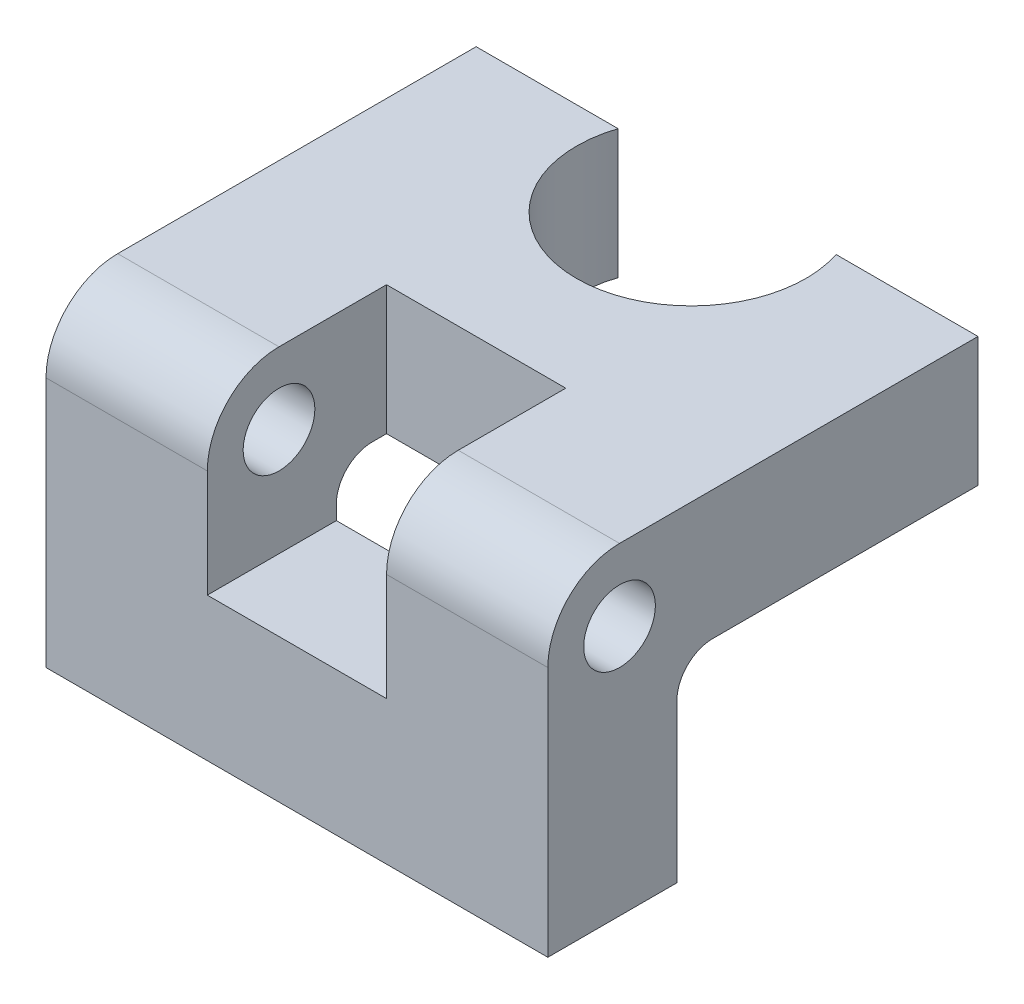
ISO-10303-21;
HEADER;
FILE_DESCRIPTION(('STEP AP214'),'2;1');
FILE_NAME('part.step','',(''),(''),'','','');
FILE_SCHEMA(('AUTOMOTIVE_DESIGN { 1 0 10303 214 1 1 1 1 }'));
ENDSEC;
DATA;
#1=APPLICATION_CONTEXT('core data for automotive mechanical design processes');
#2=APPLICATION_PROTOCOL_DEFINITION('international standard','automotive_design',2000,#1);
#3=PRODUCT_CONTEXT('',#1,'mechanical');
#4=PRODUCT('Part','Part','',(#3));
#5=PRODUCT_RELATED_PRODUCT_CATEGORY('part','',(#4));
#6=PRODUCT_DEFINITION_FORMATION('','',#4);
#7=PRODUCT_DEFINITION_CONTEXT('part definition',#1,'design');
#8=PRODUCT_DEFINITION('design','',#6,#7);
#9=PRODUCT_DEFINITION_SHAPE('','',#8);
#10=(LENGTH_UNIT() NAMED_UNIT(*) SI_UNIT(.MILLI.,.METRE.));
#11=(NAMED_UNIT(*) PLANE_ANGLE_UNIT() SI_UNIT($,.RADIAN.));
#12=(NAMED_UNIT(*) SI_UNIT($,.STERADIAN.) SOLID_ANGLE_UNIT());
#13=UNCERTAINTY_MEASURE_WITH_UNIT(LENGTH_MEASURE(1.E-05),#10,'distance_accuracy_value','');
#14=(GEOMETRIC_REPRESENTATION_CONTEXT(3) GLOBAL_UNCERTAINTY_ASSIGNED_CONTEXT((#13)) GLOBAL_UNIT_ASSIGNED_CONTEXT((#10,
#11,#12)) REPRESENTATION_CONTEXT('',''));
#15=CARTESIAN_POINT('',(0.,0.,0.));
#16=DIRECTION('',(0.,0.,1.));
#17=DIRECTION('',(1.,0.,0.));
#18=AXIS2_PLACEMENT_3D('',#15,#16,#17);
#19=CARTESIAN_POINT('',(0.,45.,-60.));
#20=DIRECTION('',(0.,0.,1.));
#21=DIRECTION('',(1.,0.,0.));
#22=AXIS2_PLACEMENT_3D('',#19,#20,#21);
#23=PLANE('',#22);
#24=DIRECTION('',(1.,0.,0.));
#25=VECTOR('',#24,1.);
#26=CARTESIAN_POINT('',(0.,27.,-60.));
#27=LINE('',#26,#25);
#28=CARTESIAN_POINT('',(50.1986841535707,27.,-60.));
#29=VERTEX_POINT('',#28);
#30=CARTESIAN_POINT('',(70.,27.,-60.));
#31=VERTEX_POINT('',#30);
#32=EDGE_CURVE('E235',#29,#31,#27,.T.);
#33=ORIENTED_EDGE('',*,*,#32,.F.);
#34=DIRECTION('',(0.,1.,0.));
#35=VECTOR('',#34,1.);
#36=CARTESIAN_POINT('',(50.1986841535707,0.,-60.));
#37=LINE('',#36,#35);
#38=CARTESIAN_POINT('',(50.1986841535707,45.,-60.));
#39=VERTEX_POINT('',#38);
#40=EDGE_CURVE('E222',#29,#39,#37,.T.);
#41=ORIENTED_EDGE('',*,*,#40,.T.);
#42=DIRECTION('',(-1.,0.,0.));
#43=VECTOR('',#42,1.);
#44=CARTESIAN_POINT('',(0.,45.,-60.));
#45=LINE('',#44,#43);
#46=CARTESIAN_POINT('',(70.,45.,-60.));
#47=VERTEX_POINT('',#46);
#48=EDGE_CURVE('E257',#47,#39,#45,.T.);
#49=ORIENTED_EDGE('',*,*,#48,.F.);
#50=DIRECTION('',(0.,-1.,0.));
#51=VECTOR('',#50,1.);
#52=CARTESIAN_POINT('',(70.,45.,-60.));
#53=LINE('',#52,#51);
#54=EDGE_CURVE('E275',#47,#31,#53,.T.);
#55=ORIENTED_EDGE('',*,*,#54,.T.);
#56=EDGE_LOOP('',(#33,#41,#49,#55));
#57=FACE_BOUND('',#56,.T.);
#58=ADVANCED_FACE('F39',(#57),#23,.F.);
#59=CARTESIAN_POINT('',(0.,45.,0.));
#60=DIRECTION('',(1.,0.,0.));
#61=DIRECTION('',(0.,0.,-1.));
#62=AXIS2_PLACEMENT_3D('',#59,#60,#61);
#63=PLANE('',#62);
#64=CARTESIAN_POINT('',(0.,35.,-10.));
#65=DIRECTION('',(1.,0.,0.));
#66=DIRECTION('',(0.,0.,-1.));
#67=AXIS2_PLACEMENT_3D('',#64,#65,#66);
#68=CIRCLE('',#67,5.);
#69=CARTESIAN_POINT('',(0.,35.,-15.));
#70=VERTEX_POINT('',#69);
#71=EDGE_CURVE('E391',#70,#70,#68,.T.);
#72=ORIENTED_EDGE('',*,*,#71,.T.);
#73=EDGE_LOOP('',(#72));
#74=FACE_BOUND('',#73,.T.);
#75=DIRECTION('',(0.,-1.,0.));
#76=VECTOR('',#75,1.);
#77=CARTESIAN_POINT('',(0.,45.,0.));
#78=LINE('',#77,#76);
#79=CARTESIAN_POINT('',(0.,35.,0.));
#80=VERTEX_POINT('',#79);
#81=CARTESIAN_POINT('',(0.,0.,0.));
#82=VERTEX_POINT('',#81);
#83=EDGE_CURVE('E282',#80,#82,#78,.T.);
#84=ORIENTED_EDGE('',*,*,#83,.F.);
#85=CARTESIAN_POINT('',(0.,35.,-10.));
#86=DIRECTION('',(1.,0.,0.));
#87=DIRECTION('',(0.,0.,-1.));
#88=AXIS2_PLACEMENT_3D('',#85,#86,#87);
#89=CIRCLE('',#88,10.);
#90=CARTESIAN_POINT('',(0.,45.,-10.));
#91=VERTEX_POINT('',#90);
#92=EDGE_CURVE('E322',#80,#91,#89,.F.);
#93=ORIENTED_EDGE('',*,*,#92,.T.);
#94=DIRECTION('',(0.,0.,1.));
#95=VECTOR('',#94,1.);
#96=CARTESIAN_POINT('',(0.,45.,0.));
#97=LINE('',#96,#95);
#98=CARTESIAN_POINT('',(0.,45.,-60.));
#99=VERTEX_POINT('',#98);
#100=EDGE_CURVE('E249',#99,#91,#97,.T.);
#101=ORIENTED_EDGE('',*,*,#100,.F.);
#102=DIRECTION('',(0.,-1.,0.));
#103=VECTOR('',#102,1.);
#104=CARTESIAN_POINT('',(0.,45.,-60.));
#105=LINE('',#104,#103);
#106=CARTESIAN_POINT('',(0.,27.,-60.));
#107=VERTEX_POINT('',#106);
#108=EDGE_CURVE('E261',#99,#107,#105,.T.);
#109=ORIENTED_EDGE('',*,*,#108,.T.);
#110=DIRECTION('',(0.,0.,1.));
#111=VECTOR('',#110,1.);
#112=CARTESIAN_POINT('',(0.,27.,-18.));
#113=LINE('',#112,#111);
#114=CARTESIAN_POINT('',(0.,27.,-23.));
#115=VERTEX_POINT('',#114);
#116=EDGE_CURVE('E227',#107,#115,#113,.T.);
#117=ORIENTED_EDGE('',*,*,#116,.T.);
#118=CARTESIAN_POINT('',(0.,22.,-23.));
#119=DIRECTION('',(1.,0.,0.));
#120=DIRECTION('',(0.,0.,-1.));
#121=AXIS2_PLACEMENT_3D('',#118,#119,#120);
#122=CIRCLE('',#121,5.);
#123=CARTESIAN_POINT('',(0.,22.,-18.));
#124=VERTEX_POINT('',#123);
#125=EDGE_CURVE('E341',#115,#124,#122,.T.);
#126=ORIENTED_EDGE('',*,*,#125,.T.);
#127=DIRECTION('',(0.,-1.,0.));
#128=VECTOR('',#127,1.);
#129=CARTESIAN_POINT('',(0.,0.,-18.));
#130=LINE('',#129,#128);
#131=CARTESIAN_POINT('',(0.,0.,-18.));
#132=VERTEX_POINT('',#131);
#133=EDGE_CURVE('E231',#124,#132,#130,.T.);
#134=ORIENTED_EDGE('',*,*,#133,.T.);
#135=DIRECTION('',(0.,0.,1.));
#136=VECTOR('',#135,1.);
#137=CARTESIAN_POINT('',(0.,0.,0.));
#138=LINE('',#137,#136);
#139=EDGE_CURVE('E244',#132,#82,#138,.T.);
#140=ORIENTED_EDGE('',*,*,#139,.T.);
#141=EDGE_LOOP('',(#84,#93,#101,#109,#117,#126,#134,#140));
#142=FACE_BOUND('',#141,.T.);
#143=ADVANCED_FACE('F415',(#74,#142),#63,.F.);
#144=CARTESIAN_POINT('',(0.,45.,0.));
#145=DIRECTION('',(0.,0.,-1.));
#146=DIRECTION('',(-1.,0.,0.));
#147=AXIS2_PLACEMENT_3D('',#144,#145,#146);
#148=PLANE('',#147);
#149=DIRECTION('',(0.,-1.,0.));
#150=VECTOR('',#149,1.);
#151=CARTESIAN_POINT('',(70.,45.,0.));
#152=LINE('',#151,#150);
#153=CARTESIAN_POINT('',(70.,35.,0.));
#154=VERTEX_POINT('',#153);
#155=CARTESIAN_POINT('',(70.,0.,0.));
#156=VERTEX_POINT('',#155);
#157=EDGE_CURVE('E279',#154,#156,#152,.T.);
#158=ORIENTED_EDGE('',*,*,#157,.F.);
#159=DIRECTION('',(1.,0.,0.));
#160=VECTOR('',#159,1.);
#161=CARTESIAN_POINT('',(0.,35.,0.));
#162=LINE('',#161,#160);
#163=CARTESIAN_POINT('',(47.5,35.,0.));
#164=VERTEX_POINT('',#163);
#165=EDGE_CURVE('E313',#154,#164,#162,.F.);
#166=ORIENTED_EDGE('',*,*,#165,.T.);
#167=DIRECTION('',(0.,1.,0.));
#168=VECTOR('',#167,1.);
#169=CARTESIAN_POINT('',(47.5,45.,0.));
#170=LINE('',#169,#168);
#171=CARTESIAN_POINT('',(47.5,20.,0.));
#172=VERTEX_POINT('',#171);
#173=EDGE_CURVE('E177',#172,#164,#170,.T.);
#174=ORIENTED_EDGE('',*,*,#173,.F.);
#175=DIRECTION('',(1.,0.,0.));
#176=VECTOR('',#175,1.);
#177=CARTESIAN_POINT('',(22.5,20.,0.));
#178=LINE('',#177,#176);
#179=CARTESIAN_POINT('',(22.5,20.,0.));
#180=VERTEX_POINT('',#179);
#181=EDGE_CURVE('E374',#180,#172,#178,.T.);
#182=ORIENTED_EDGE('',*,*,#181,.F.);
#183=DIRECTION('',(0.,-1.,0.));
#184=VECTOR('',#183,1.);
#185=CARTESIAN_POINT('',(22.5,45.,0.));
#186=LINE('',#185,#184);
#187=CARTESIAN_POINT('',(22.5,35.,0.));
#188=VERTEX_POINT('',#187);
#189=EDGE_CURVE('E376',#188,#180,#186,.T.);
#190=ORIENTED_EDGE('',*,*,#189,.F.);
#191=DIRECTION('',(1.,0.,0.));
#192=VECTOR('',#191,1.);
#193=CARTESIAN_POINT('',(0.,35.,0.));
#194=LINE('',#193,#192);
#195=EDGE_CURVE('E310',#188,#80,#194,.F.);
#196=ORIENTED_EDGE('',*,*,#195,.T.);
#197=ORIENTED_EDGE('',*,*,#83,.T.);
#198=DIRECTION('',(1.,0.,0.));
#199=VECTOR('',#198,1.);
#200=CARTESIAN_POINT('',(0.,0.,0.));
#201=LINE('',#200,#199);
#202=EDGE_CURVE('E265',#82,#156,#201,.T.);
#203=ORIENTED_EDGE('',*,*,#202,.T.);
#204=EDGE_LOOP('',(#158,#166,#174,#182,#190,#196,#197,#203));
#205=FACE_BOUND('',#204,.T.);
#206=ADVANCED_FACE('F361',(#205),#148,.F.);
#207=CARTESIAN_POINT('',(70.,45.,0.));
#208=DIRECTION('',(-1.,0.,0.));
#209=DIRECTION('',(0.,0.,1.));
#210=AXIS2_PLACEMENT_3D('',#207,#208,#209);
#211=PLANE('',#210);
#212=CARTESIAN_POINT('',(70.,35.,-10.));
#213=DIRECTION('',(1.,0.,0.));
#214=DIRECTION('',(0.,0.,-1.));
#215=AXIS2_PLACEMENT_3D('',#212,#213,#214);
#216=CIRCLE('',#215,5.);
#217=CARTESIAN_POINT('',(70.,35.,-15.));
#218=VERTEX_POINT('',#217);
#219=EDGE_CURVE('E387',#218,#218,#216,.T.);
#220=ORIENTED_EDGE('',*,*,#219,.F.);
#221=EDGE_LOOP('',(#220));
#222=FACE_BOUND('',#221,.T.);
#223=DIRECTION('',(0.,0.,-1.));
#224=VECTOR('',#223,1.);
#225=CARTESIAN_POINT('',(70.,45.,0.));
#226=LINE('',#225,#224);
#227=CARTESIAN_POINT('',(70.,45.,-10.));
#228=VERTEX_POINT('',#227);
#229=EDGE_CURVE('E252',#228,#47,#226,.T.);
#230=ORIENTED_EDGE('',*,*,#229,.F.);
#231=CARTESIAN_POINT('',(70.,35.,-10.));
#232=DIRECTION('',(-1.,0.,0.));
#233=DIRECTION('',(0.,0.,1.));
#234=AXIS2_PLACEMENT_3D('',#231,#232,#233);
#235=CIRCLE('',#234,10.);
#236=EDGE_CURVE('E307',#228,#154,#235,.F.);
#237=ORIENTED_EDGE('',*,*,#236,.T.);
#238=ORIENTED_EDGE('',*,*,#157,.T.);
#239=DIRECTION('',(0.,0.,-1.));
#240=VECTOR('',#239,1.);
#241=CARTESIAN_POINT('',(70.,0.,0.));
#242=LINE('',#241,#240);
#243=CARTESIAN_POINT('',(70.,0.,-18.));
#244=VERTEX_POINT('',#243);
#245=EDGE_CURVE('E253',#156,#244,#242,.T.);
#246=ORIENTED_EDGE('',*,*,#245,.T.);
#247=DIRECTION('',(0.,-1.,0.));
#248=VECTOR('',#247,1.);
#249=CARTESIAN_POINT('',(70.,0.,-18.));
#250=LINE('',#249,#248);
#251=CARTESIAN_POINT('',(70.,22.,-18.));
#252=VERTEX_POINT('',#251);
#253=EDGE_CURVE('E232',#252,#244,#250,.T.);
#254=ORIENTED_EDGE('',*,*,#253,.F.);
#255=CARTESIAN_POINT('',(70.,22.,-23.));
#256=DIRECTION('',(-1.,0.,0.));
#257=DIRECTION('',(0.,0.,1.));
#258=AXIS2_PLACEMENT_3D('',#255,#256,#257);
#259=CIRCLE('',#258,5.);
#260=CARTESIAN_POINT('',(70.,27.,-23.));
#261=VERTEX_POINT('',#260);
#262=EDGE_CURVE('E49',#252,#261,#259,.T.);
#263=ORIENTED_EDGE('',*,*,#262,.T.);
#264=DIRECTION('',(0.,0.,1.));
#265=VECTOR('',#264,1.);
#266=CARTESIAN_POINT('',(70.,27.,-18.));
#267=LINE('',#266,#265);
#268=EDGE_CURVE('E226',#31,#261,#267,.T.);
#269=ORIENTED_EDGE('',*,*,#268,.F.);
#270=ORIENTED_EDGE('',*,*,#54,.F.);
#271=EDGE_LOOP('',(#230,#237,#238,#246,#254,#263,#269,#270));
#272=FACE_BOUND('',#271,.T.);
#273=ADVANCED_FACE('F352',(#222,#272),#211,.F.);
#274=CARTESIAN_POINT('',(19.8013158464293,45.,-60.));
#275=VERTEX_POINT('',#274);
#276=EDGE_CURVE('E256',#275,#99,#45,.T.);
#277=ORIENTED_EDGE('',*,*,#276,.F.);
#278=DIRECTION('',(0.,1.,0.));
#279=VECTOR('',#278,1.);
#280=CARTESIAN_POINT('',(19.8013158464293,0.,-60.));
#281=LINE('',#280,#279);
#282=CARTESIAN_POINT('',(19.8013158464293,27.,-60.));
#283=VERTEX_POINT('',#282);
#284=EDGE_CURVE('E218',#275,#283,#281,.F.);
#285=ORIENTED_EDGE('',*,*,#284,.T.);
#286=EDGE_CURVE('E245',#107,#283,#27,.T.);
#287=ORIENTED_EDGE('',*,*,#286,.F.);
#288=ORIENTED_EDGE('',*,*,#108,.F.);
#289=EDGE_LOOP('',(#277,#285,#287,#288));
#290=FACE_BOUND('',#289,.T.);
#291=ADVANCED_FACE('F417',(#290),#23,.F.);
#292=CARTESIAN_POINT('',(0.,45.,0.));
#293=DIRECTION('',(0.,-1.,0.));
#294=DIRECTION('',(0.,0.,-1.));
#295=AXIS2_PLACEMENT_3D('',#292,#293,#294);
#296=PLANE('',#295);
#297=DIRECTION('',(0.,0.,1.));
#298=VECTOR('',#297,1.);
#299=CARTESIAN_POINT('',(47.5,45.,-25.));
#300=LINE('',#299,#298);
#301=CARTESIAN_POINT('',(47.5,45.,-25.));
#302=VERTEX_POINT('',#301);
#303=CARTESIAN_POINT('',(47.5,45.,-10.));
#304=VERTEX_POINT('',#303);
#305=EDGE_CURVE('E196',#302,#304,#300,.T.);
#306=ORIENTED_EDGE('',*,*,#305,.T.);
#307=DIRECTION('',(1.,0.,0.));
#308=VECTOR('',#307,1.);
#309=CARTESIAN_POINT('',(0.,45.,-10.));
#310=LINE('',#309,#308);
#311=EDGE_CURVE('E303',#304,#228,#310,.T.);
#312=ORIENTED_EDGE('',*,*,#311,.T.);
#313=ORIENTED_EDGE('',*,*,#229,.T.);
#314=ORIENTED_EDGE('',*,*,#48,.T.);
#315=CARTESIAN_POINT('',(35.,45.,-55.));
#316=DIRECTION('',(0.,1.,0.));
#317=DIRECTION('',(0.,0.,1.));
#318=AXIS2_PLACEMENT_3D('',#315,#316,#317);
#319=CIRCLE('',#318,16.);
#320=EDGE_CURVE('E215',#275,#39,#319,.T.);
#321=ORIENTED_EDGE('',*,*,#320,.F.);
#322=ORIENTED_EDGE('',*,*,#276,.T.);
#323=ORIENTED_EDGE('',*,*,#100,.T.);
#324=DIRECTION('',(1.,0.,0.));
#325=VECTOR('',#324,1.);
#326=CARTESIAN_POINT('',(0.,45.,-10.));
#327=LINE('',#326,#325);
#328=CARTESIAN_POINT('',(22.5,45.,-10.));
#329=VERTEX_POINT('',#328);
#330=EDGE_CURVE('E193',#91,#329,#327,.T.);
#331=ORIENTED_EDGE('',*,*,#330,.T.);
#332=DIRECTION('',(0.,0.,1.));
#333=VECTOR('',#332,1.);
#334=CARTESIAN_POINT('',(22.5,45.,-25.));
#335=LINE('',#334,#333);
#336=CARTESIAN_POINT('',(22.5,45.,-25.));
#337=VERTEX_POINT('',#336);
#338=EDGE_CURVE('E169',#337,#329,#335,.T.);
#339=ORIENTED_EDGE('',*,*,#338,.F.);
#340=DIRECTION('',(-1.,0.,0.));
#341=VECTOR('',#340,1.);
#342=CARTESIAN_POINT('',(22.5,45.,-25.));
#343=LINE('',#342,#341);
#344=EDGE_CURVE('E181',#302,#337,#343,.T.);
#345=ORIENTED_EDGE('',*,*,#344,.F.);
#346=EDGE_LOOP('',(#306,#312,#313,#314,#321,#322,#323,#331,#339,#345));
#347=FACE_BOUND('',#346,.T.);
#348=ADVANCED_FACE('F190',(#347),#296,.F.);
#349=CARTESIAN_POINT('',(0.,0.,0.));
#350=DIRECTION('',(0.,-1.,0.));
#351=DIRECTION('',(0.,0.,-1.));
#352=AXIS2_PLACEMENT_3D('',#349,#350,#351);
#353=PLANE('',#352);
#354=DIRECTION('',(1.,0.,0.));
#355=VECTOR('',#354,1.);
#356=CARTESIAN_POINT('',(0.,0.,-18.));
#357=LINE('',#356,#355);
#358=EDGE_CURVE('E240',#132,#244,#357,.T.);
#359=ORIENTED_EDGE('',*,*,#358,.T.);
#360=ORIENTED_EDGE('',*,*,#245,.F.);
#361=ORIENTED_EDGE('',*,*,#202,.F.);
#362=ORIENTED_EDGE('',*,*,#139,.F.);
#363=EDGE_LOOP('',(#359,#360,#361,#362));
#364=FACE_BOUND('',#363,.T.);
#365=ADVANCED_FACE('F430',(#364),#353,.T.);
#366=CARTESIAN_POINT('',(0.,0.,-18.));
#367=DIRECTION('',(0.,0.,1.));
#368=DIRECTION('',(1.,0.,0.));
#369=AXIS2_PLACEMENT_3D('',#366,#367,#368);
#370=PLANE('',#369);
#371=ORIENTED_EDGE('',*,*,#133,.F.);
#372=DIRECTION('',(1.,0.,0.));
#373=VECTOR('',#372,1.);
#374=CARTESIAN_POINT('',(22.5,22.,-18.));
#375=LINE('',#374,#373);
#376=CARTESIAN_POINT('',(22.5,22.,-18.));
#377=VERTEX_POINT('',#376);
#378=EDGE_CURVE('E329',#124,#377,#375,.T.);
#379=ORIENTED_EDGE('',*,*,#378,.T.);
#380=DIRECTION('',(0.,-1.,0.));
#381=VECTOR('',#380,1.);
#382=CARTESIAN_POINT('',(22.5,0.,-18.));
#383=LINE('',#382,#381);
#384=CARTESIAN_POINT('',(22.5,20.,-18.));
#385=VERTEX_POINT('',#384);
#386=EDGE_CURVE('E201',#377,#385,#383,.T.);
#387=ORIENTED_EDGE('',*,*,#386,.T.);
#388=DIRECTION('',(1.,0.,0.));
#389=VECTOR('',#388,1.);
#390=CARTESIAN_POINT('',(0.,20.,-18.));
#391=LINE('',#390,#389);
#392=CARTESIAN_POINT('',(47.5,20.,-18.));
#393=VERTEX_POINT('',#392);
#394=EDGE_CURVE('E297',#385,#393,#391,.T.);
#395=ORIENTED_EDGE('',*,*,#394,.T.);
#396=DIRECTION('',(0.,1.,0.));
#397=VECTOR('',#396,1.);
#398=CARTESIAN_POINT('',(47.5,0.,-18.));
#399=LINE('',#398,#397);
#400=CARTESIAN_POINT('',(47.5,22.,-18.));
#401=VERTEX_POINT('',#400);
#402=EDGE_CURVE('E195',#393,#401,#399,.T.);
#403=ORIENTED_EDGE('',*,*,#402,.T.);
#404=DIRECTION('',(1.,0.,0.));
#405=VECTOR('',#404,1.);
#406=CARTESIAN_POINT('',(70.,22.,-18.));
#407=LINE('',#406,#405);
#408=EDGE_CURVE('E325',#401,#252,#407,.T.);
#409=ORIENTED_EDGE('',*,*,#408,.T.);
#410=ORIENTED_EDGE('',*,*,#253,.T.);
#411=ORIENTED_EDGE('',*,*,#358,.F.);
#412=EDGE_LOOP('',(#371,#379,#387,#395,#403,#409,#410,#411));
#413=FACE_BOUND('',#412,.T.);
#414=ADVANCED_FACE('F449',(#413),#370,.F.);
#415=CARTESIAN_POINT('',(0.,27.,-18.));
#416=DIRECTION('',(0.,1.,0.));
#417=DIRECTION('',(0.,0.,1.));
#418=AXIS2_PLACEMENT_3D('',#415,#416,#417);
#419=PLANE('',#418);
#420=DIRECTION('',(0.,0.,1.));
#421=VECTOR('',#420,1.);
#422=CARTESIAN_POINT('',(22.5,27.,-18.));
#423=LINE('',#422,#421);
#424=CARTESIAN_POINT('',(22.5,27.,-25.));
#425=VERTEX_POINT('',#424);
#426=CARTESIAN_POINT('',(22.5,27.,-23.));
#427=VERTEX_POINT('',#426);
#428=EDGE_CURVE('E171',#425,#427,#423,.T.);
#429=ORIENTED_EDGE('',*,*,#428,.T.);
#430=DIRECTION('',(1.,0.,0.));
#431=VECTOR('',#430,1.);
#432=CARTESIAN_POINT('',(0.,27.,-23.));
#433=LINE('',#432,#431);
#434=EDGE_CURVE('E335',#427,#115,#433,.F.);
#435=ORIENTED_EDGE('',*,*,#434,.T.);
#436=ORIENTED_EDGE('',*,*,#116,.F.);
#437=ORIENTED_EDGE('',*,*,#286,.T.);
#438=CARTESIAN_POINT('',(35.,27.,-55.));
#439=DIRECTION('',(0.,1.,0.));
#440=DIRECTION('',(0.,0.,1.));
#441=AXIS2_PLACEMENT_3D('',#438,#439,#440);
#442=CIRCLE('',#441,16.);
#443=EDGE_CURVE('E285',#283,#29,#442,.T.);
#444=ORIENTED_EDGE('',*,*,#443,.T.);
#445=ORIENTED_EDGE('',*,*,#32,.T.);
#446=ORIENTED_EDGE('',*,*,#268,.T.);
#447=DIRECTION('',(1.,0.,0.));
#448=VECTOR('',#447,1.);
#449=CARTESIAN_POINT('',(47.5,27.,-23.));
#450=LINE('',#449,#448);
#451=CARTESIAN_POINT('',(47.5,27.,-23.));
#452=VERTEX_POINT('',#451);
#453=EDGE_CURVE('E56',#261,#452,#450,.F.);
#454=ORIENTED_EDGE('',*,*,#453,.T.);
#455=DIRECTION('',(0.,0.,-1.));
#456=VECTOR('',#455,1.);
#457=CARTESIAN_POINT('',(47.5,27.,-18.));
#458=LINE('',#457,#456);
#459=CARTESIAN_POINT('',(47.5,27.,-25.));
#460=VERTEX_POINT('',#459);
#461=EDGE_CURVE('E292',#452,#460,#458,.T.);
#462=ORIENTED_EDGE('',*,*,#461,.T.);
#463=DIRECTION('',(1.,0.,0.));
#464=VECTOR('',#463,1.);
#465=CARTESIAN_POINT('',(0.,27.,-25.));
#466=LINE('',#465,#464);
#467=EDGE_CURVE('E289',#425,#460,#466,.T.);
#468=ORIENTED_EDGE('',*,*,#467,.F.);
#469=EDGE_LOOP('',(#429,#435,#436,#437,#444,#445,#446,#454,#462,#468));
#470=FACE_BOUND('',#469,.T.);
#471=ADVANCED_FACE('F348',(#470),#419,.F.);
#472=CARTESIAN_POINT('',(35.,0.,-55.));
#473=DIRECTION('',(0.,1.,0.));
#474=DIRECTION('',(0.,0.,1.));
#475=AXIS2_PLACEMENT_3D('',#472,#473,#474);
#476=CYLINDRICAL_SURFACE('',#475,16.);
#477=ORIENTED_EDGE('',*,*,#443,.F.);
#478=ORIENTED_EDGE('',*,*,#284,.F.);
#479=ORIENTED_EDGE('',*,*,#320,.T.);
#480=ORIENTED_EDGE('',*,*,#40,.F.);
#481=EDGE_LOOP('',(#477,#478,#479,#480));
#482=FACE_BOUND('',#481,.T.);
#483=ADVANCED_FACE('F460',(#482),#476,.F.);
#484=CARTESIAN_POINT('',(22.5,20.,-25.));
#485=DIRECTION('',(0.,-1.,0.));
#486=DIRECTION('',(1.,0.,0.));
#487=AXIS2_PLACEMENT_3D('',#484,#485,#486);
#488=PLANE('',#487);
#489=DIRECTION('',(0.,0.,1.));
#490=VECTOR('',#489,1.);
#491=CARTESIAN_POINT('',(22.5,20.,-25.));
#492=LINE('',#491,#490);
#493=EDGE_CURVE('E187',#385,#180,#492,.T.);
#494=ORIENTED_EDGE('',*,*,#493,.T.);
#495=ORIENTED_EDGE('',*,*,#181,.T.);
#496=DIRECTION('',(0.,0.,1.));
#497=VECTOR('',#496,1.);
#498=CARTESIAN_POINT('',(47.5,20.,-25.));
#499=LINE('',#498,#497);
#500=EDGE_CURVE('E203',#393,#172,#499,.T.);
#501=ORIENTED_EDGE('',*,*,#500,.F.);
#502=ORIENTED_EDGE('',*,*,#394,.F.);
#503=EDGE_LOOP('',(#494,#495,#501,#502));
#504=FACE_BOUND('',#503,.T.);
#505=ADVANCED_FACE('F458',(#504),#488,.F.);
#506=CARTESIAN_POINT('',(22.5,45.,-25.));
#507=DIRECTION('',(-1.,0.,0.));
#508=DIRECTION('',(0.,-1.,0.));
#509=AXIS2_PLACEMENT_3D('',#506,#507,#508);
#510=PLANE('',#509);
#511=CARTESIAN_POINT('',(22.5,35.,-10.));
#512=DIRECTION('',(-1.,0.,0.));
#513=DIRECTION('',(0.,-1.,0.));
#514=AXIS2_PLACEMENT_3D('',#511,#512,#513);
#515=CIRCLE('',#514,5.);
#516=CARTESIAN_POINT('',(22.5,30.,-10.));
#517=VERTEX_POINT('',#516);
#518=EDGE_CURVE('E379',#517,#517,#515,.T.);
#519=ORIENTED_EDGE('',*,*,#518,.T.);
#520=EDGE_LOOP('',(#519));
#521=FACE_BOUND('',#520,.T.);
#522=ORIENTED_EDGE('',*,*,#338,.T.);
#523=CARTESIAN_POINT('',(22.5,35.,-10.));
#524=DIRECTION('',(-1.,0.,0.));
#525=DIRECTION('',(0.,-1.,0.));
#526=AXIS2_PLACEMENT_3D('',#523,#524,#525);
#527=CIRCLE('',#526,10.);
#528=EDGE_CURVE('E319',#329,#188,#527,.F.);
#529=ORIENTED_EDGE('',*,*,#528,.T.);
#530=ORIENTED_EDGE('',*,*,#189,.T.);
#531=ORIENTED_EDGE('',*,*,#493,.F.);
#532=ORIENTED_EDGE('',*,*,#386,.F.);
#533=CARTESIAN_POINT('',(22.5,22.,-23.));
#534=DIRECTION('',(-1.,0.,0.));
#535=DIRECTION('',(0.,-1.,0.));
#536=AXIS2_PLACEMENT_3D('',#533,#534,#535);
#537=CIRCLE('',#536,5.);
#538=EDGE_CURVE('E338',#377,#427,#537,.T.);
#539=ORIENTED_EDGE('',*,*,#538,.T.);
#540=ORIENTED_EDGE('',*,*,#428,.F.);
#541=DIRECTION('',(0.,-1.,0.));
#542=VECTOR('',#541,1.);
#543=CARTESIAN_POINT('',(22.5,45.,-25.));
#544=LINE('',#543,#542);
#545=EDGE_CURVE('E165',#337,#425,#544,.T.);
#546=ORIENTED_EDGE('',*,*,#545,.F.);
#547=EDGE_LOOP('',(#522,#529,#530,#531,#532,#539,#540,#546));
#548=FACE_BOUND('',#547,.T.);
#549=ADVANCED_FACE('F167',(#521,#548),#510,.F.);
#550=CARTESIAN_POINT('',(47.5,45.,-25.));
#551=DIRECTION('',(1.,0.,0.));
#552=DIRECTION('',(0.,1.,0.));
#553=AXIS2_PLACEMENT_3D('',#550,#551,#552);
#554=PLANE('',#553);
#555=CARTESIAN_POINT('',(47.5,35.,-10.));
#556=DIRECTION('',(1.,0.,0.));
#557=DIRECTION('',(0.,1.,0.));
#558=AXIS2_PLACEMENT_3D('',#555,#556,#557);
#559=CIRCLE('',#558,5.);
#560=CARTESIAN_POINT('',(47.5,40.,-10.));
#561=VERTEX_POINT('',#560);
#562=EDGE_CURVE('E43',#561,#561,#559,.T.);
#563=ORIENTED_EDGE('',*,*,#562,.T.);
#564=EDGE_LOOP('',(#563));
#565=FACE_BOUND('',#564,.T.);
#566=ORIENTED_EDGE('',*,*,#173,.T.);
#567=CARTESIAN_POINT('',(47.5,35.,-10.));
#568=DIRECTION('',(1.,0.,0.));
#569=DIRECTION('',(0.,1.,0.));
#570=AXIS2_PLACEMENT_3D('',#567,#568,#569);
#571=CIRCLE('',#570,10.);
#572=EDGE_CURVE('E316',#164,#304,#571,.F.);
#573=ORIENTED_EDGE('',*,*,#572,.T.);
#574=ORIENTED_EDGE('',*,*,#305,.F.);
#575=DIRECTION('',(0.,1.,0.));
#576=VECTOR('',#575,1.);
#577=CARTESIAN_POINT('',(47.5,45.,-25.));
#578=LINE('',#577,#576);
#579=EDGE_CURVE('E176',#460,#302,#578,.T.);
#580=ORIENTED_EDGE('',*,*,#579,.F.);
#581=ORIENTED_EDGE('',*,*,#461,.F.);
#582=CARTESIAN_POINT('',(47.5,22.,-23.));
#583=DIRECTION('',(1.,0.,0.));
#584=DIRECTION('',(0.,1.,0.));
#585=AXIS2_PLACEMENT_3D('',#582,#583,#584);
#586=CIRCLE('',#585,5.);
#587=EDGE_CURVE('E11',#452,#401,#586,.T.);
#588=ORIENTED_EDGE('',*,*,#587,.T.);
#589=ORIENTED_EDGE('',*,*,#402,.F.);
#590=ORIENTED_EDGE('',*,*,#500,.T.);
#591=EDGE_LOOP('',(#566,#573,#574,#580,#581,#588,#589,#590));
#592=FACE_BOUND('',#591,.T.);
#593=ADVANCED_FACE('F369',(#565,#592),#554,.F.);
#594=CARTESIAN_POINT('',(0.,0.,-25.));
#595=DIRECTION('',(0.,0.,1.));
#596=DIRECTION('',(1.,0.,0.));
#597=AXIS2_PLACEMENT_3D('',#594,#595,#596);
#598=PLANE('',#597);
#599=ORIENTED_EDGE('',*,*,#467,.T.);
#600=ORIENTED_EDGE('',*,*,#579,.T.);
#601=ORIENTED_EDGE('',*,*,#344,.T.);
#602=ORIENTED_EDGE('',*,*,#545,.T.);
#603=EDGE_LOOP('',(#599,#600,#601,#602));
#604=FACE_BOUND('',#603,.T.);
#605=ADVANCED_FACE('F182',(#604),#598,.T.);
#606=CARTESIAN_POINT('',(0.,35.,-10.));
#607=DIRECTION('',(1.,0.,0.));
#608=DIRECTION('',(0.,0.,-1.));
#609=AXIS2_PLACEMENT_3D('',#606,#607,#608);
#610=CYLINDRICAL_SURFACE('',#609,10.);
#611=ORIENTED_EDGE('',*,*,#572,.F.);
#612=ORIENTED_EDGE('',*,*,#165,.F.);
#613=ORIENTED_EDGE('',*,*,#236,.F.);
#614=ORIENTED_EDGE('',*,*,#311,.F.);
#615=EDGE_LOOP('',(#611,#612,#613,#614));
#616=FACE_BOUND('',#615,.T.);
#617=ADVANCED_FACE('F367',(#616),#610,.T.);
#618=CARTESIAN_POINT('',(0.,35.,-10.));
#619=DIRECTION('',(1.,0.,0.));
#620=DIRECTION('',(0.,0.,-1.));
#621=AXIS2_PLACEMENT_3D('',#618,#619,#620);
#622=CYLINDRICAL_SURFACE('',#621,10.);
#623=ORIENTED_EDGE('',*,*,#92,.F.);
#624=ORIENTED_EDGE('',*,*,#195,.F.);
#625=ORIENTED_EDGE('',*,*,#528,.F.);
#626=ORIENTED_EDGE('',*,*,#330,.F.);
#627=EDGE_LOOP('',(#623,#624,#625,#626));
#628=FACE_BOUND('',#627,.T.);
#629=ADVANCED_FACE('F439',(#628),#622,.T.);
#630=CARTESIAN_POINT('',(0.,22.,-23.));
#631=DIRECTION('',(-1.,0.,0.));
#632=DIRECTION('',(0.,0.,1.));
#633=AXIS2_PLACEMENT_3D('',#630,#631,#632);
#634=CYLINDRICAL_SURFACE('',#633,5.);
#635=ORIENTED_EDGE('',*,*,#125,.F.);
#636=ORIENTED_EDGE('',*,*,#434,.F.);
#637=ORIENTED_EDGE('',*,*,#538,.F.);
#638=ORIENTED_EDGE('',*,*,#378,.F.);
#639=EDGE_LOOP('',(#635,#636,#637,#638));
#640=FACE_BOUND('',#639,.T.);
#641=ADVANCED_FACE('F411',(#640),#634,.F.);
#642=CARTESIAN_POINT('',(0.,22.,-23.));
#643=DIRECTION('',(-1.,0.,0.));
#644=DIRECTION('',(0.,0.,1.));
#645=AXIS2_PLACEMENT_3D('',#642,#643,#644);
#646=CYLINDRICAL_SURFACE('',#645,5.);
#647=ORIENTED_EDGE('',*,*,#587,.F.);
#648=ORIENTED_EDGE('',*,*,#453,.F.);
#649=ORIENTED_EDGE('',*,*,#262,.F.);
#650=ORIENTED_EDGE('',*,*,#408,.F.);
#651=EDGE_LOOP('',(#647,#648,#649,#650));
#652=FACE_BOUND('',#651,.T.);
#653=ADVANCED_FACE('F41',(#652),#646,.F.);
#654=CARTESIAN_POINT('',(0.,35.,-10.));
#655=DIRECTION('',(1.,0.,0.));
#656=DIRECTION('',(0.,0.,-1.));
#657=AXIS2_PLACEMENT_3D('',#654,#655,#656);
#658=CYLINDRICAL_SURFACE('',#657,5.);
#659=ORIENTED_EDGE('',*,*,#219,.T.);
#660=EDGE_LOOP('',(#659));
#661=FACE_BOUND('',#660,.T.);
#662=ORIENTED_EDGE('',*,*,#562,.F.);
#663=EDGE_LOOP('',(#662));
#664=FACE_BOUND('',#663,.T.);
#665=ADVANCED_FACE('F401',(#661,#664),#658,.F.);
#666=ORIENTED_EDGE('',*,*,#71,.F.);
#667=EDGE_LOOP('',(#666));
#668=FACE_BOUND('',#667,.T.);
#669=ORIENTED_EDGE('',*,*,#518,.F.);
#670=EDGE_LOOP('',(#669));
#671=FACE_BOUND('',#670,.T.);
#672=ADVANCED_FACE('F403',(#668,#671),#658,.F.);
#673=CLOSED_SHELL('',(#58,#143,#206,#273,#291,#348,#365,#414,#471,#483,#505,#549,#593,#605,#617,
#629,#641,#653,#665,#672));
#674=MANIFOLD_SOLID_BREP('B2',#673);
#675=ADVANCED_BREP_SHAPE_REPRESENTATION('',(#18,#674),#14);
#676=SHAPE_DEFINITION_REPRESENTATION(#9,#675);
ENDSEC;
END-ISO-10303-21;
